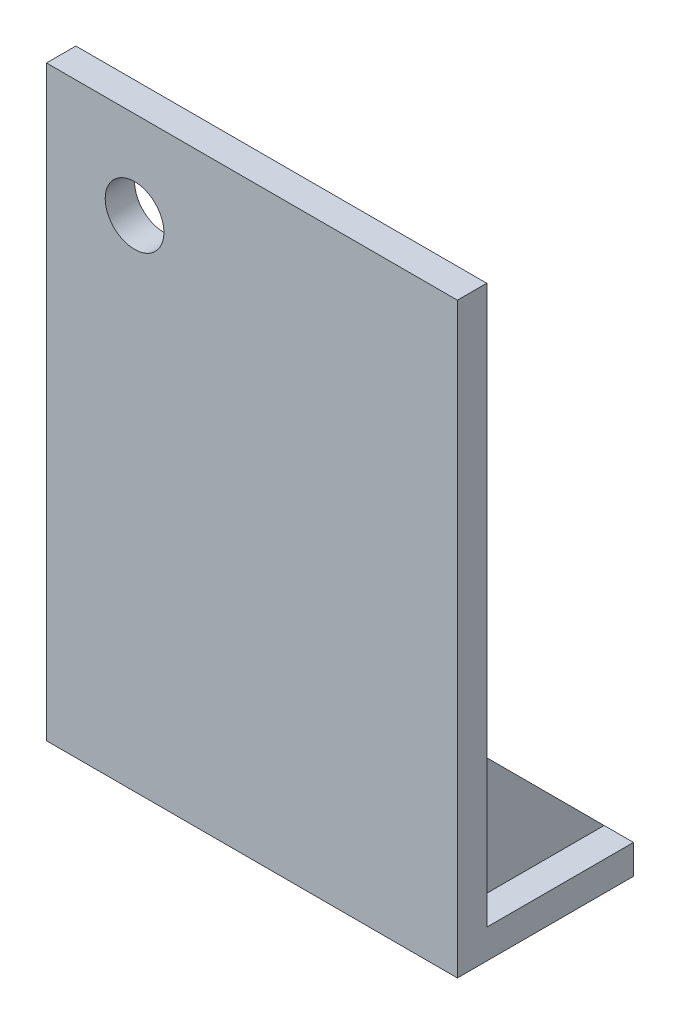
ISO-10303-21;
HEADER;
FILE_DESCRIPTION(('STEP AP214'),'2;1');
FILE_NAME('part.step','',(''),(''),'','','');
FILE_SCHEMA(('AUTOMOTIVE_DESIGN { 1 0 10303 214 1 1 1 1 }'));
ENDSEC;
DATA;
#1=APPLICATION_CONTEXT('core data for automotive mechanical design processes');
#2=APPLICATION_PROTOCOL_DEFINITION('international standard','automotive_design',2000,#1);
#3=PRODUCT_CONTEXT('',#1,'mechanical');
#4=PRODUCT('Part','Part','',(#3));
#5=PRODUCT_RELATED_PRODUCT_CATEGORY('part','',(#4));
#6=PRODUCT_DEFINITION_FORMATION('','',#4);
#7=PRODUCT_DEFINITION_CONTEXT('part definition',#1,'design');
#8=PRODUCT_DEFINITION('design','',#6,#7);
#9=PRODUCT_DEFINITION_SHAPE('','',#8);
#10=(LENGTH_UNIT() NAMED_UNIT(*) SI_UNIT(.MILLI.,.METRE.));
#11=(NAMED_UNIT(*) PLANE_ANGLE_UNIT() SI_UNIT($,.RADIAN.));
#12=(NAMED_UNIT(*) SI_UNIT($,.STERADIAN.) SOLID_ANGLE_UNIT());
#13=UNCERTAINTY_MEASURE_WITH_UNIT(LENGTH_MEASURE(1.E-05),#10,'distance_accuracy_value','');
#14=(GEOMETRIC_REPRESENTATION_CONTEXT(3) GLOBAL_UNCERTAINTY_ASSIGNED_CONTEXT((#13)) GLOBAL_UNIT_ASSIGNED_CONTEXT((#10,
#11,#12)) REPRESENTATION_CONTEXT('',''));
#15=CARTESIAN_POINT('',(0.,0.,0.));
#16=DIRECTION('',(0.,0.,1.));
#17=DIRECTION('',(1.,0.,0.));
#18=AXIS2_PLACEMENT_3D('',#15,#16,#17);
#19=CARTESIAN_POINT('',(0.,-95.,0.));
#20=DIRECTION('',(0.,1.,0.));
#21=DIRECTION('',(0.,0.,1.));
#22=AXIS2_PLACEMENT_3D('',#19,#20,#21);
#23=PLANE('',#22);
#24=DIRECTION('',(-1.,0.,0.));
#25=VECTOR('',#24,1.);
#26=CARTESIAN_POINT('',(70.,-95.,0.));
#27=LINE('',#26,#25);
#28=CARTESIAN_POINT('',(100.,-95.,0.));
#29=VERTEX_POINT('',#28);
#30=CARTESIAN_POINT('',(40.,-95.,0.));
#31=VERTEX_POINT('',#30);
#32=EDGE_CURVE('E128',#29,#31,#27,.T.);
#33=ORIENTED_EDGE('',*,*,#32,.F.);
#34=DIRECTION('',(0.,0.,-1.));
#35=VECTOR('',#34,1.);
#36=CARTESIAN_POINT('',(100.,-95.,-25.));
#37=LINE('',#36,#35);
#38=CARTESIAN_POINT('',(100.,-95.,-25.));
#39=VERTEX_POINT('',#38);
#40=EDGE_CURVE('E174',#29,#39,#37,.T.);
#41=ORIENTED_EDGE('',*,*,#40,.T.);
#42=DIRECTION('',(1.,0.,0.));
#43=VECTOR('',#42,1.);
#44=CARTESIAN_POINT('',(110.,-95.,-25.));
#45=LINE('',#44,#43);
#46=CARTESIAN_POINT('',(40.,-95.,-25.));
#47=VERTEX_POINT('',#46);
#48=EDGE_CURVE('E153',#47,#39,#45,.T.);
#49=ORIENTED_EDGE('',*,*,#48,.F.);
#50=DIRECTION('',(0.,0.,-1.));
#51=VECTOR('',#50,1.);
#52=CARTESIAN_POINT('',(40.,-95.,4.99999999999999));
#53=LINE('',#52,#51);
#54=EDGE_CURVE('E157',#31,#47,#53,.T.);
#55=ORIENTED_EDGE('',*,*,#54,.F.);
#56=EDGE_LOOP('',(#33,#41,#49,#55));
#57=FACE_BOUND('',#56,.T.);
#58=ADVANCED_FACE('F36',(#57),#23,.T.);
#59=CARTESIAN_POINT('',(40.,-30.,5.));
#60=DIRECTION('',(1.,0.,0.));
#61=DIRECTION('',(0.,1.,0.));
#62=AXIS2_PLACEMENT_3D('',#59,#60,#61);
#63=PLANE('',#62);
#64=DIRECTION('',(0.,-1.,0.));
#65=VECTOR('',#64,1.);
#66=CARTESIAN_POINT('',(40.,-30.,0.));
#67=LINE('',#66,#65);
#68=CARTESIAN_POINT('',(40.,0.,0.));
#69=VERTEX_POINT('',#68);
#70=EDGE_CURVE('E61',#69,#31,#67,.T.);
#71=ORIENTED_EDGE('',*,*,#70,.T.);
#72=ORIENTED_EDGE('',*,*,#54,.T.);
#73=DIRECTION('',(0.,1.,0.));
#74=VECTOR('',#73,1.);
#75=CARTESIAN_POINT('',(40.,-100.,-25.));
#76=LINE('',#75,#74);
#77=CARTESIAN_POINT('',(40.,-100.,-25.));
#78=VERTEX_POINT('',#77);
#79=EDGE_CURVE('E144',#78,#47,#76,.T.);
#80=ORIENTED_EDGE('',*,*,#79,.F.);
#81=DIRECTION('',(0.,0.,-1.));
#82=VECTOR('',#81,1.);
#83=CARTESIAN_POINT('',(40.,-100.,4.99999999999999));
#84=LINE('',#83,#82);
#85=CARTESIAN_POINT('',(40.,-100.,4.99999999999999));
#86=VERTEX_POINT('',#85);
#87=EDGE_CURVE('E163',#86,#78,#84,.T.);
#88=ORIENTED_EDGE('',*,*,#87,.F.);
#89=DIRECTION('',(0.,-1.,0.));
#90=VECTOR('',#89,1.);
#91=CARTESIAN_POINT('',(40.,-30.,5.));
#92=LINE('',#91,#90);
#93=CARTESIAN_POINT('',(40.,0.,5.));
#94=VERTEX_POINT('',#93);
#95=EDGE_CURVE('E45',#94,#86,#92,.T.);
#96=ORIENTED_EDGE('',*,*,#95,.F.);
#97=DIRECTION('',(0.,0.,-1.));
#98=VECTOR('',#97,1.);
#99=CARTESIAN_POINT('',(40.,0.,5.));
#100=LINE('',#99,#98);
#101=EDGE_CURVE('E134',#94,#69,#100,.T.);
#102=ORIENTED_EDGE('',*,*,#101,.T.);
#103=EDGE_LOOP('',(#71,#72,#80,#88,#96,#102));
#104=FACE_BOUND('',#103,.T.);
#105=ADVANCED_FACE('F38',(#104),#63,.F.);
#106=CARTESIAN_POINT('',(5.,0.,5.));
#107=DIRECTION('',(0.,1.,0.));
#108=DIRECTION('',(0.,0.,1.));
#109=AXIS2_PLACEMENT_3D('',#106,#107,#108);
#110=PLANE('',#109);
#111=ORIENTED_EDGE('',*,*,#101,.F.);
#112=DIRECTION('',(1.,0.,0.));
#113=VECTOR('',#112,1.);
#114=CARTESIAN_POINT('',(5.,0.,5.));
#115=LINE('',#114,#113);
#116=CARTESIAN_POINT('',(110.,0.,5.));
#117=VERTEX_POINT('',#116);
#118=EDGE_CURVE('E11',#94,#117,#115,.T.);
#119=ORIENTED_EDGE('',*,*,#118,.T.);
#120=DIRECTION('',(0.,0.,-1.));
#121=VECTOR('',#120,1.);
#122=CARTESIAN_POINT('',(110.,0.,5.));
#123=LINE('',#122,#121);
#124=CARTESIAN_POINT('',(110.,0.,0.));
#125=VERTEX_POINT('',#124);
#126=EDGE_CURVE('E137',#117,#125,#123,.T.);
#127=ORIENTED_EDGE('',*,*,#126,.T.);
#128=DIRECTION('',(1.,0.,0.));
#129=VECTOR('',#128,1.);
#130=CARTESIAN_POINT('',(5.,0.,0.));
#131=LINE('',#130,#129);
#132=EDGE_CURVE('E40',#69,#125,#131,.T.);
#133=ORIENTED_EDGE('',*,*,#132,.F.);
#134=EDGE_LOOP('',(#111,#119,#127,#133));
#135=FACE_BOUND('',#134,.T.);
#136=ADVANCED_FACE('F194',(#135),#110,.T.);
#137=CARTESIAN_POINT('',(5.,-5.,5.));
#138=DIRECTION('',(0.,0.,1.));
#139=DIRECTION('',(1.,0.,0.));
#140=AXIS2_PLACEMENT_3D('',#137,#138,#139);
#141=PLANE('',#140);
#142=CARTESIAN_POINT('',(55.,-15.,5.));
#143=DIRECTION('',(0.,0.,-1.));
#144=DIRECTION('',(-1.,0.,0.));
#145=AXIS2_PLACEMENT_3D('',#142,#143,#144);
#146=CIRCLE('',#145,5.);
#147=CARTESIAN_POINT('',(50.,-15.,5.));
#148=VERTEX_POINT('',#147);
#149=EDGE_CURVE('E140',#148,#148,#146,.T.);
#150=ORIENTED_EDGE('',*,*,#149,.T.);
#151=EDGE_LOOP('',(#150));
#152=FACE_BOUND('',#151,.T.);
#153=ORIENTED_EDGE('',*,*,#95,.T.);
#154=DIRECTION('',(-1.,0.,0.));
#155=VECTOR('',#154,1.);
#156=CARTESIAN_POINT('',(110.,-100.,5.));
#157=LINE('',#156,#155);
#158=CARTESIAN_POINT('',(110.,-100.,5.));
#159=VERTEX_POINT('',#158);
#160=EDGE_CURVE('E165',#159,#86,#157,.T.);
#161=ORIENTED_EDGE('',*,*,#160,.F.);
#162=DIRECTION('',(0.,-1.,0.));
#163=VECTOR('',#162,1.);
#164=CARTESIAN_POINT('',(110.,-5.00000000000001,5.));
#165=LINE('',#164,#163);
#166=EDGE_CURVE('E130',#117,#159,#165,.T.);
#167=ORIENTED_EDGE('',*,*,#166,.F.);
#168=ORIENTED_EDGE('',*,*,#118,.F.);
#169=EDGE_LOOP('',(#153,#161,#167,#168));
#170=FACE_BOUND('',#169,.T.);
#171=ADVANCED_FACE('F235',(#152,#170),#141,.T.);
#172=CARTESIAN_POINT('',(5.,-5.,0.));
#173=DIRECTION('',(0.,0.,1.));
#174=DIRECTION('',(1.,0.,0.));
#175=AXIS2_PLACEMENT_3D('',#172,#173,#174);
#176=PLANE('',#175);
#177=CARTESIAN_POINT('',(55.,-15.,0.));
#178=DIRECTION('',(0.,0.,-1.));
#179=DIRECTION('',(-1.,0.,0.));
#180=AXIS2_PLACEMENT_3D('',#177,#178,#179);
#181=CIRCLE('',#180,5.);
#182=CARTESIAN_POINT('',(50.,-15.,0.));
#183=VERTEX_POINT('',#182);
#184=EDGE_CURVE('E141',#183,#183,#181,.T.);
#185=ORIENTED_EDGE('',*,*,#184,.F.);
#186=EDGE_LOOP('',(#185));
#187=FACE_BOUND('',#186,.T.);
#188=CARTESIAN_POINT('',(110.,-95.,0.));
#189=VERTEX_POINT('',#188);
#190=CARTESIAN_POINT('',(105.,-95.,0.));
#191=VERTEX_POINT('',#190);
#192=EDGE_CURVE('E119',#189,#191,#27,.T.);
#193=ORIENTED_EDGE('',*,*,#192,.T.);
#194=DIRECTION('',(0.,-1.,0.));
#195=VECTOR('',#194,1.);
#196=CARTESIAN_POINT('',(105.,-95.,0.));
#197=LINE('',#196,#195);
#198=CARTESIAN_POINT('',(105.,-70.,0.));
#199=VERTEX_POINT('',#198);
#200=EDGE_CURVE('E107',#199,#191,#197,.T.);
#201=ORIENTED_EDGE('',*,*,#200,.F.);
#202=DIRECTION('',(-1.,0.,0.));
#203=VECTOR('',#202,1.);
#204=CARTESIAN_POINT('',(105.,-70.,0.));
#205=LINE('',#204,#203);
#206=CARTESIAN_POINT('',(100.,-70.,0.));
#207=VERTEX_POINT('',#206);
#208=EDGE_CURVE('E171',#199,#207,#205,.T.);
#209=ORIENTED_EDGE('',*,*,#208,.T.);
#210=DIRECTION('',(0.,-1.,0.));
#211=VECTOR('',#210,1.);
#212=CARTESIAN_POINT('',(100.,-95.,0.));
#213=LINE('',#212,#211);
#214=EDGE_CURVE('E177',#207,#29,#213,.T.);
#215=ORIENTED_EDGE('',*,*,#214,.T.);
#216=ORIENTED_EDGE('',*,*,#32,.T.);
#217=ORIENTED_EDGE('',*,*,#70,.F.);
#218=ORIENTED_EDGE('',*,*,#132,.T.);
#219=DIRECTION('',(0.,-1.,0.));
#220=VECTOR('',#219,1.);
#221=CARTESIAN_POINT('',(110.,-5.00000000000001,0.));
#222=LINE('',#221,#220);
#223=EDGE_CURVE('E127',#125,#189,#222,.T.);
#224=ORIENTED_EDGE('',*,*,#223,.T.);
#225=EDGE_LOOP('',(#193,#201,#209,#215,#216,#217,#218,#224));
#226=FACE_BOUND('',#225,.T.);
#227=ADVANCED_FACE('F125',(#187,#226),#176,.F.);
#228=CARTESIAN_POINT('',(110.,-5.00000000000001,5.));
#229=DIRECTION('',(1.,0.,0.));
#230=DIRECTION('',(0.,1.,0.));
#231=AXIS2_PLACEMENT_3D('',#228,#229,#230);
#232=PLANE('',#231);
#233=ORIENTED_EDGE('',*,*,#223,.F.);
#234=ORIENTED_EDGE('',*,*,#126,.F.);
#235=ORIENTED_EDGE('',*,*,#166,.T.);
#236=DIRECTION('',(0.,0.,1.));
#237=VECTOR('',#236,1.);
#238=CARTESIAN_POINT('',(110.,-100.,5.));
#239=LINE('',#238,#237);
#240=CARTESIAN_POINT('',(110.,-100.,-25.));
#241=VERTEX_POINT('',#240);
#242=EDGE_CURVE('E156',#241,#159,#239,.T.);
#243=ORIENTED_EDGE('',*,*,#242,.F.);
#244=DIRECTION('',(0.,1.,0.));
#245=VECTOR('',#244,1.);
#246=CARTESIAN_POINT('',(110.,-100.,-25.));
#247=LINE('',#246,#245);
#248=CARTESIAN_POINT('',(110.,-95.,-25.));
#249=VERTEX_POINT('',#248);
#250=EDGE_CURVE('E149',#241,#249,#247,.T.);
#251=ORIENTED_EDGE('',*,*,#250,.T.);
#252=DIRECTION('',(0.,0.,1.));
#253=VECTOR('',#252,1.);
#254=CARTESIAN_POINT('',(110.,-95.,5.));
#255=LINE('',#254,#253);
#256=EDGE_CURVE('E159',#249,#189,#255,.T.);
#257=ORIENTED_EDGE('',*,*,#256,.T.);
#258=EDGE_LOOP('',(#233,#234,#235,#243,#251,#257));
#259=FACE_BOUND('',#258,.T.);
#260=ADVANCED_FACE('F197',(#259),#232,.T.);
#261=CARTESIAN_POINT('',(55.,-15.,5.));
#262=DIRECTION('',(0.,0.,-1.));
#263=DIRECTION('',(-1.,0.,0.));
#264=AXIS2_PLACEMENT_3D('',#261,#262,#263);
#265=CYLINDRICAL_SURFACE('',#264,5.);
#266=ORIENTED_EDGE('',*,*,#149,.F.);
#267=EDGE_LOOP('',(#266));
#268=FACE_BOUND('',#267,.T.);
#269=ORIENTED_EDGE('',*,*,#184,.T.);
#270=EDGE_LOOP('',(#269));
#271=FACE_BOUND('',#270,.T.);
#272=ADVANCED_FACE('F220',(#268,#271),#265,.F.);
#273=DIRECTION('',(0.,0.,-1.));
#274=VECTOR('',#273,1.);
#275=CARTESIAN_POINT('',(105.,-95.,-25.));
#276=LINE('',#275,#274);
#277=CARTESIAN_POINT('',(105.,-95.,-25.));
#278=VERTEX_POINT('',#277);
#279=EDGE_CURVE('E110',#191,#278,#276,.T.);
#280=ORIENTED_EDGE('',*,*,#279,.F.);
#281=ORIENTED_EDGE('',*,*,#192,.F.);
#282=ORIENTED_EDGE('',*,*,#256,.F.);
#283=EDGE_CURVE('E121',#278,#249,#45,.T.);
#284=ORIENTED_EDGE('',*,*,#283,.F.);
#285=EDGE_LOOP('',(#280,#281,#282,#284));
#286=FACE_BOUND('',#285,.T.);
#287=ADVANCED_FACE('F117',(#286),#23,.T.);
#288=CARTESIAN_POINT('',(110.,-100.,-25.));
#289=DIRECTION('',(0.,0.,1.));
#290=DIRECTION('',(1.,0.,0.));
#291=AXIS2_PLACEMENT_3D('',#288,#289,#290);
#292=PLANE('',#291);
#293=ORIENTED_EDGE('',*,*,#48,.T.);
#294=DIRECTION('',(-1.,0.,0.));
#295=VECTOR('',#294,1.);
#296=CARTESIAN_POINT('',(105.,-95.,-25.));
#297=LINE('',#296,#295);
#298=EDGE_CURVE('E161',#278,#39,#297,.T.);
#299=ORIENTED_EDGE('',*,*,#298,.F.);
#300=ORIENTED_EDGE('',*,*,#283,.T.);
#301=ORIENTED_EDGE('',*,*,#250,.F.);
#302=DIRECTION('',(1.,0.,0.));
#303=VECTOR('',#302,1.);
#304=CARTESIAN_POINT('',(110.,-100.,-25.));
#305=LINE('',#304,#303);
#306=EDGE_CURVE('E152',#78,#241,#305,.T.);
#307=ORIENTED_EDGE('',*,*,#306,.F.);
#308=ORIENTED_EDGE('',*,*,#79,.T.);
#309=EDGE_LOOP('',(#293,#299,#300,#301,#307,#308));
#310=FACE_BOUND('',#309,.T.);
#311=ADVANCED_FACE('F202',(#310),#292,.F.);
#312=CARTESIAN_POINT('',(0.,-100.,0.));
#313=DIRECTION('',(0.,1.,0.));
#314=DIRECTION('',(0.,0.,1.));
#315=AXIS2_PLACEMENT_3D('',#312,#313,#314);
#316=PLANE('',#315);
#317=ORIENTED_EDGE('',*,*,#242,.T.);
#318=ORIENTED_EDGE('',*,*,#160,.T.);
#319=ORIENTED_EDGE('',*,*,#87,.T.);
#320=ORIENTED_EDGE('',*,*,#306,.T.);
#321=EDGE_LOOP('',(#317,#318,#319,#320));
#322=FACE_BOUND('',#321,.T.);
#323=ADVANCED_FACE('F225',(#322),#316,.F.);
#324=CARTESIAN_POINT('',(105.,-70.,0.));
#325=DIRECTION('',(0.,-0.707106781186548,0.707106781186547));
#326=DIRECTION('',(0.,-0.707106781186547,-0.707106781186548));
#327=AXIS2_PLACEMENT_3D('',#324,#325,#326);
#328=PLANE('',#327);
#329=DIRECTION('',(0.,0.707106781186547,0.707106781186548));
#330=VECTOR('',#329,1.);
#331=CARTESIAN_POINT('',(100.,-70.,0.));
#332=LINE('',#331,#330);
#333=EDGE_CURVE('E114',#39,#207,#332,.T.);
#334=ORIENTED_EDGE('',*,*,#333,.T.);
#335=ORIENTED_EDGE('',*,*,#208,.F.);
#336=DIRECTION('',(0.,0.707106781186547,0.707106781186548));
#337=VECTOR('',#336,1.);
#338=CARTESIAN_POINT('',(105.,-70.,0.));
#339=LINE('',#338,#337);
#340=EDGE_CURVE('E53',#278,#199,#339,.T.);
#341=ORIENTED_EDGE('',*,*,#340,.F.);
#342=ORIENTED_EDGE('',*,*,#298,.T.);
#343=EDGE_LOOP('',(#334,#335,#341,#342));
#344=FACE_BOUND('',#343,.T.);
#345=ADVANCED_FACE('F203',(#344),#328,.F.);
#346=CARTESIAN_POINT('',(105.,0.,0.));
#347=DIRECTION('',(1.,0.,0.));
#348=DIRECTION('',(0.,0.,-1.));
#349=AXIS2_PLACEMENT_3D('',#346,#347,#348);
#350=PLANE('',#349);
#351=ORIENTED_EDGE('',*,*,#200,.T.);
#352=ORIENTED_EDGE('',*,*,#279,.T.);
#353=ORIENTED_EDGE('',*,*,#340,.T.);
#354=EDGE_LOOP('',(#351,#352,#353));
#355=FACE_BOUND('',#354,.T.);
#356=ADVANCED_FACE('F109',(#355),#350,.T.);
#357=CARTESIAN_POINT('',(100.,0.,0.));
#358=DIRECTION('',(1.,0.,0.));
#359=DIRECTION('',(0.,0.,-1.));
#360=AXIS2_PLACEMENT_3D('',#357,#358,#359);
#361=PLANE('',#360);
#362=ORIENTED_EDGE('',*,*,#214,.F.);
#363=ORIENTED_EDGE('',*,*,#333,.F.);
#364=ORIENTED_EDGE('',*,*,#40,.F.);
#365=EDGE_LOOP('',(#362,#363,#364));
#366=FACE_BOUND('',#365,.T.);
#367=ADVANCED_FACE('F204',(#366),#361,.F.);
#368=CLOSED_SHELL('',(#58,#105,#136,#171,#227,#260,#272,#287,#311,#323,#345,#356,#367));
#369=MANIFOLD_SOLID_BREP('B2',#368);
#370=ADVANCED_BREP_SHAPE_REPRESENTATION('',(#18,#369),#14);
#371=SHAPE_DEFINITION_REPRESENTATION(#9,#370);
ENDSEC;
END-ISO-10303-21;
